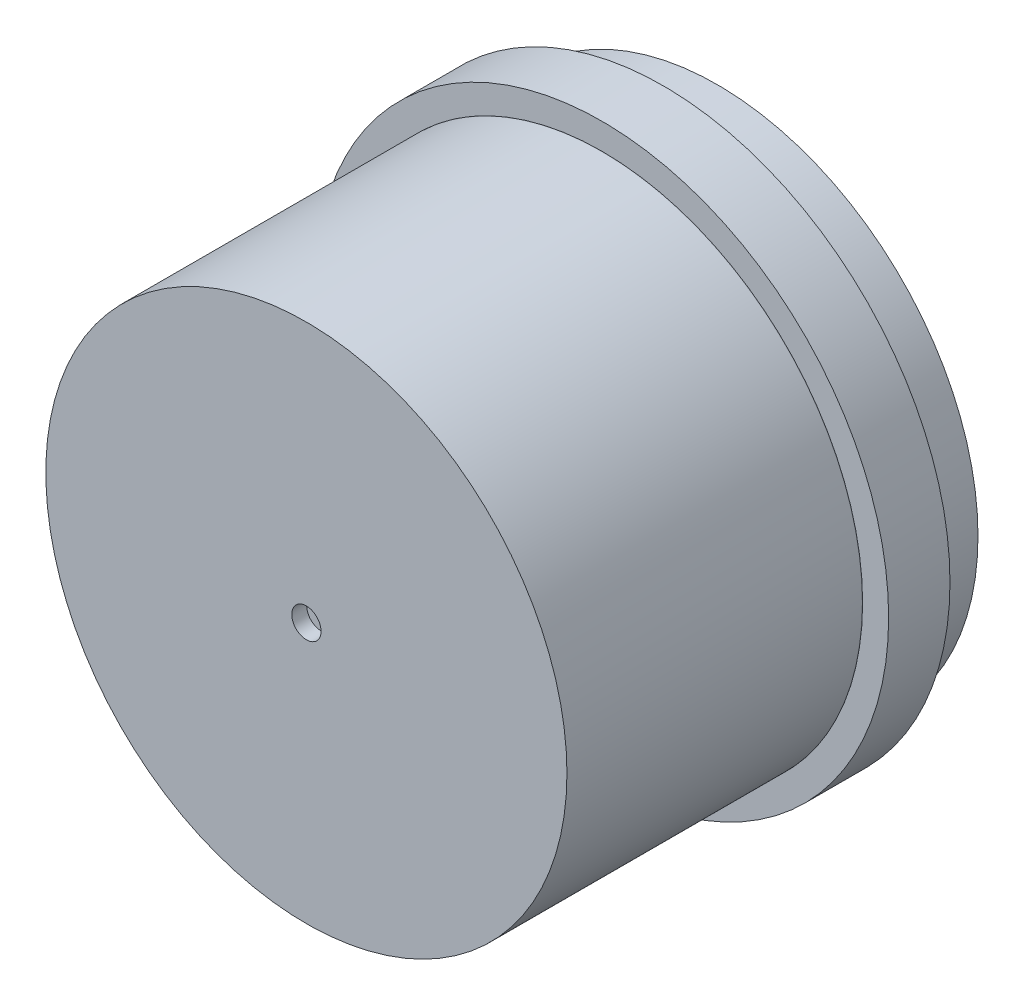
ISO-10303-21;
HEADER;
FILE_DESCRIPTION(('STEP AP214'),'2;1');
FILE_NAME('part.step','',(''),(''),'','','');
FILE_SCHEMA(('AUTOMOTIVE_DESIGN { 1 0 10303 214 1 1 1 1 }'));
ENDSEC;
DATA;
#1=APPLICATION_CONTEXT('core data for automotive mechanical design processes');
#2=APPLICATION_PROTOCOL_DEFINITION('international standard','automotive_design',2000,#1);
#3=PRODUCT_CONTEXT('',#1,'mechanical');
#4=PRODUCT('Part','Part','',(#3));
#5=PRODUCT_RELATED_PRODUCT_CATEGORY('part','',(#4));
#6=PRODUCT_DEFINITION_FORMATION('','',#4);
#7=PRODUCT_DEFINITION_CONTEXT('part definition',#1,'design');
#8=PRODUCT_DEFINITION('design','',#6,#7);
#9=PRODUCT_DEFINITION_SHAPE('','',#8);
#10=(LENGTH_UNIT() NAMED_UNIT(*) SI_UNIT(.MILLI.,.METRE.));
#11=(NAMED_UNIT(*) PLANE_ANGLE_UNIT() SI_UNIT($,.RADIAN.));
#12=(NAMED_UNIT(*) SI_UNIT($,.STERADIAN.) SOLID_ANGLE_UNIT());
#13=UNCERTAINTY_MEASURE_WITH_UNIT(LENGTH_MEASURE(1.E-05),#10,'distance_accuracy_value','');
#14=(GEOMETRIC_REPRESENTATION_CONTEXT(3) GLOBAL_UNCERTAINTY_ASSIGNED_CONTEXT((#13)) GLOBAL_UNIT_ASSIGNED_CONTEXT((#10,
#11,#12)) REPRESENTATION_CONTEXT('',''));
#15=CARTESIAN_POINT('',(0.,0.,0.));
#16=DIRECTION('',(0.,0.,1.));
#17=DIRECTION('',(1.,0.,0.));
#18=AXIS2_PLACEMENT_3D('',#15,#16,#17);
#19=CARTESIAN_POINT('',(0.,0.,-18.9845679100614));
#20=DIRECTION('',(0.,0.,-1.));
#21=DIRECTION('',(-1.,0.,0.));
#22=AXIS2_PLACEMENT_3D('',#19,#20,#21);
#23=PLANE('',#22);
#24=DIRECTION('',(-1.,0.,0.));
#25=VECTOR('',#24,1.);
#26=CARTESIAN_POINT('',(0.,39.9999999964937,-18.9845679100614));
#27=LINE('',#26,#25);
#28=CARTESIAN_POINT('',(0.000748999934972199,39.9999999964937,-18.9845679100614));
#29=VERTEX_POINT('',#28);
#30=CARTESIAN_POINT('',(-0.000748999934989471,40.,-18.9845679100614));
#31=VERTEX_POINT('',#30);
#32=EDGE_CURVE('P0_E19',#29,#31,#27,.T.);
#33=ORIENTED_EDGE('',*,*,#32,.T.);
#34=CARTESIAN_POINT('',(-0.000748999934989471,40.,-18.9845679100614));
#35=CARTESIAN_POINT('',(1.89567518805954E-09,40.0008099017736,-18.9845679100614));
#36=CARTESIAN_POINT('',(0.000748999934972199,39.9999999964937,-18.9845679100614));
#37=B_SPLINE_CURVE_WITH_KNOTS('',2,(#34,#35,#36),.UNSPECIFIED.,.F.,.F.,(3,3),(0.,1.),.UNSPECIFIED.);
#38=EDGE_CURVE('P0_E11',#31,#29,#37,.T.);
#39=ORIENTED_EDGE('',*,*,#38,.T.);
#40=EDGE_LOOP('',(#33,#39));
#41=FACE_BOUND('',#40,.T.);
#42=ADVANCED_FACE('P0_F17',(#41),#23,.T.);
#43=OPEN_SHELL('',(#42));
#44=SHELL_BASED_SURFACE_MODEL('P0_B1',(#43));
#45=CARTESIAN_POINT('',(0.,0.,-28.4));
#46=DIRECTION('',(0.,0.,-1.));
#47=DIRECTION('',(-1.,0.,0.));
#48=AXIS2_PLACEMENT_3D('',#45,#46,#47);
#49=PLANE('',#48);
#50=CARTESIAN_POINT('',(0.,0.,-28.4));
#51=DIRECTION('',(0.,0.,1.));
#52=DIRECTION('',(1.,0.,0.));
#53=AXIS2_PLACEMENT_3D('',#50,#51,#52);
#54=CIRCLE('',#53,2.25);
#55=CARTESIAN_POINT('',(2.25,0.,-28.4));
#56=VERTEX_POINT('',#55);
#57=EDGE_CURVE('P1_E20',#56,#56,#54,.F.);
#58=ORIENTED_EDGE('',*,*,#57,.T.);
#59=EDGE_LOOP('',(#58));
#60=FACE_BOUND('',#59,.T.);
#61=ADVANCED_FACE('P1_F17',(#60),#49,.T.);
#62=CARTESIAN_POINT('',(0.,0.,-34.1));
#63=DIRECTION('',(0.,0.,1.));
#64=DIRECTION('',(1.,0.,0.));
#65=AXIS2_PLACEMENT_3D('',#62,#63,#64);
#66=CYLINDRICAL_SURFACE('',#65,2.25);
#67=ORIENTED_EDGE('',*,*,#57,.F.);
#68=EDGE_LOOP('',(#67));
#69=FACE_BOUND('',#68,.T.);
#70=CARTESIAN_POINT('',(0.,0.,-33.6));
#71=DIRECTION('',(0.,0.,-1.));
#72=DIRECTION('',(-0.158255657589961,0.987398170365314,0.));
#73=AXIS2_PLACEMENT_3D('',#70,#71,#72);
#74=CIRCLE('',#73,2.25);
#75=CARTESIAN_POINT('',(-0.356075229577412,2.22164588332196,-33.6));
#76=VERTEX_POINT('',#75);
#77=EDGE_CURVE('P1_E146',#76,#76,#74,.F.);
#78=ORIENTED_EDGE('',*,*,#77,.F.);
#79=EDGE_LOOP('',(#78));
#80=FACE_BOUND('',#79,.T.);
#81=ADVANCED_FACE('P1_F151',(#69,#80),#66,.F.);
#82=CARTESIAN_POINT('',(0.,0.,-33.6));
#83=DIRECTION('',(0.,0.,-1.));
#84=DIRECTION('',(-0.158255657589961,0.987398170365314,0.));
#85=AXIS2_PLACEMENT_3D('',#82,#83,#84);
#86=TOROIDAL_SURFACE('',#85,2.75,0.5);
#87=ORIENTED_EDGE('',*,*,#77,.T.);
#88=EDGE_LOOP('',(#87));
#89=FACE_BOUND('',#88,.T.);
#90=CARTESIAN_POINT('',(0.,0.,-34.0330127018922));
#91=DIRECTION('',(0.,0.,1.));
#92=DIRECTION('',(1.,0.,0.));
#93=AXIS2_PLACEMENT_3D('',#90,#91,#92);
#94=CIRCLE('',#93,2.5);
#95=CARTESIAN_POINT('',(2.5,0.,-34.0330127018922));
#96=VERTEX_POINT('',#95);
#97=EDGE_CURVE('P1_E143',#96,#96,#94,.F.);
#98=ORIENTED_EDGE('',*,*,#97,.T.);
#99=EDGE_LOOP('',(#98));
#100=FACE_BOUND('',#99,.T.);
#101=ADVANCED_FACE('P1_F149',(#89,#100),#86,.T.);
#102=CARTESIAN_POINT('',(0.,0.,-149.837084989848));
#103=DIRECTION('',(0.,0.,1.));
#104=DIRECTION('',(1.,0.,0.));
#105=AXIS2_PLACEMENT_3D('',#102,#103,#104);
#106=CYLINDRICAL_SURFACE('',#105,2.5);
#107=ORIENTED_EDGE('',*,*,#97,.F.);
#108=EDGE_LOOP('',(#107));
#109=FACE_BOUND('',#108,.T.);
#110=CARTESIAN_POINT('',(0.,0.,-34.6));
#111=DIRECTION('',(0.,0.,1.));
#112=DIRECTION('',(1.,0.,0.));
#113=AXIS2_PLACEMENT_3D('',#110,#111,#112);
#114=CIRCLE('',#113,2.5);
#115=CARTESIAN_POINT('',(2.5,0.,-34.6));
#116=VERTEX_POINT('',#115);
#117=EDGE_CURVE('P1_E140',#116,#116,#114,.T.);
#118=ORIENTED_EDGE('',*,*,#117,.F.);
#119=EDGE_LOOP('',(#118));
#120=FACE_BOUND('',#119,.T.);
#121=ADVANCED_FACE('P1_F134',(#109,#120),#106,.F.);
#122=CARTESIAN_POINT('',(0.,0.,-35.1));
#123=DIRECTION('',(0.,0.,1.));
#124=DIRECTION('',(1.,0.,0.));
#125=AXIS2_PLACEMENT_3D('',#122,#123,#124);
#126=TOROIDAL_SURFACE('',#125,2.5,0.5);
#127=ORIENTED_EDGE('',*,*,#117,.T.);
#128=EDGE_LOOP('',(#127));
#129=FACE_BOUND('',#128,.T.);
#130=CARTESIAN_POINT('',(0.,0.,-35.1));
#131=DIRECTION('',(0.,0.,1.));
#132=DIRECTION('',(1.,0.,0.));
#133=AXIS2_PLACEMENT_3D('',#130,#131,#132);
#134=CIRCLE('',#133,2.);
#135=CARTESIAN_POINT('',(2.,0.,-35.1));
#136=VERTEX_POINT('',#135);
#137=EDGE_CURVE('P1_E139',#136,#136,#134,.F.);
#138=ORIENTED_EDGE('',*,*,#137,.T.);
#139=EDGE_LOOP('',(#138));
#140=FACE_BOUND('',#139,.T.);
#141=ADVANCED_FACE('P1_F129',(#129,#140),#126,.T.);
#142=CARTESIAN_POINT('',(0.,0.,-36.7));
#143=DIRECTION('',(0.,0.,1.));
#144=DIRECTION('',(1.,0.,0.));
#145=AXIS2_PLACEMENT_3D('',#142,#143,#144);
#146=CYLINDRICAL_SURFACE('',#145,2.);
#147=ORIENTED_EDGE('',*,*,#137,.F.);
#148=EDGE_LOOP('',(#147));
#149=FACE_BOUND('',#148,.T.);
#150=CARTESIAN_POINT('',(0.,0.,-35.2));
#151=DIRECTION('',(0.,0.,-1.));
#152=DIRECTION('',(-1.,0.,0.));
#153=AXIS2_PLACEMENT_3D('',#150,#151,#152);
#154=CIRCLE('',#153,2.);
#155=CARTESIAN_POINT('',(-2.,0.,-35.2));
#156=VERTEX_POINT('',#155);
#157=EDGE_CURVE('P1_E114',#156,#156,#154,.F.);
#158=ORIENTED_EDGE('',*,*,#157,.F.);
#159=EDGE_LOOP('',(#158));
#160=FACE_BOUND('',#159,.T.);
#161=ADVANCED_FACE('P1_F124',(#149,#160),#146,.F.);
#162=CARTESIAN_POINT('',(0.,0.,-35.2));
#163=DIRECTION('',(0.,0.,-1.));
#164=DIRECTION('',(-1.,0.,0.));
#165=AXIS2_PLACEMENT_3D('',#162,#163,#164);
#166=TOROIDAL_SURFACE('',#165,3.5,1.5);
#167=CARTESIAN_POINT('',(0.,0.,-36.3180339887499));
#168=DIRECTION('',(0.,0.,1.));
#169=DIRECTION('',(1.,0.,0.));
#170=AXIS2_PLACEMENT_3D('',#167,#168,#169);
#171=CIRCLE('',#170,2.5);
#172=CARTESIAN_POINT('',(2.5,0.,-36.3180339887499));
#173=VERTEX_POINT('',#172);
#174=EDGE_CURVE('P1_E110',#173,#173,#171,.F.);
#175=ORIENTED_EDGE('',*,*,#174,.T.);
#176=EDGE_LOOP('',(#175));
#177=FACE_BOUND('',#176,.T.);
#178=ORIENTED_EDGE('',*,*,#157,.T.);
#179=EDGE_LOOP('',(#178));
#180=FACE_BOUND('',#179,.T.);
#181=ADVANCED_FACE('P1_F119',(#177,#180),#166,.T.);
#182=CARTESIAN_POINT('',(0.,0.,-149.837084989848));
#183=DIRECTION('',(0.,0.,1.));
#184=DIRECTION('',(1.,0.,0.));
#185=AXIS2_PLACEMENT_3D('',#182,#183,#184);
#186=CYLINDRICAL_SURFACE('',#185,2.5);
#187=ORIENTED_EDGE('',*,*,#174,.F.);
#188=EDGE_LOOP('',(#187));
#189=FACE_BOUND('',#188,.T.);
#190=CARTESIAN_POINT('',(0.,0.,-36.7));
#191=DIRECTION('',(0.,0.,1.));
#192=DIRECTION('',(1.,0.,0.));
#193=AXIS2_PLACEMENT_3D('',#190,#191,#192);
#194=CIRCLE('',#193,2.5);
#195=CARTESIAN_POINT('',(2.5,0.,-36.7));
#196=VERTEX_POINT('',#195);
#197=EDGE_CURVE('P1_E113',#196,#196,#194,.T.);
#198=ORIENTED_EDGE('',*,*,#197,.F.);
#199=EDGE_LOOP('',(#198));
#200=FACE_BOUND('',#199,.T.);
#201=ADVANCED_FACE('P1_F123',(#189,#200),#186,.F.);
#202=CARTESIAN_POINT('',(0.,0.,-36.7));
#203=DIRECTION('',(0.,0.,-1.));
#204=DIRECTION('',(-1.,0.,0.));
#205=AXIS2_PLACEMENT_3D('',#202,#203,#204);
#206=PLANE('',#205);
#207=ORIENTED_EDGE('',*,*,#197,.T.);
#208=EDGE_LOOP('',(#207));
#209=FACE_BOUND('',#208,.T.);
#210=CARTESIAN_POINT('',(0.,0.,-36.7));
#211=DIRECTION('',(0.,0.,1.));
#212=DIRECTION('',(1.,0.,0.));
#213=AXIS2_PLACEMENT_3D('',#210,#211,#212);
#214=CIRCLE('',#213,40.);
#215=CARTESIAN_POINT('',(40.,0.,-36.7));
#216=VERTEX_POINT('',#215);
#217=EDGE_CURVE('P1_E216',#216,#216,#214,.T.);
#218=ORIENTED_EDGE('',*,*,#217,.F.);
#219=EDGE_LOOP('',(#218));
#220=FACE_BOUND('',#219,.T.);
#221=ADVANCED_FACE('P1_F221',(#209,#220),#206,.T.);
#222=CARTESIAN_POINT('',(0.,0.,-149.837084989848));
#223=DIRECTION('',(0.,0.,1.));
#224=DIRECTION('',(1.,0.,0.));
#225=AXIS2_PLACEMENT_3D('',#222,#223,#224);
#226=CYLINDRICAL_SURFACE('',#225,40.);
#227=ORIENTED_EDGE('',*,*,#217,.T.);
#228=EDGE_LOOP('',(#227));
#229=FACE_BOUND('',#228,.T.);
#230=CARTESIAN_POINT('',(0.,0.,-28.4));
#231=DIRECTION('',(0.,0.,1.));
#232=DIRECTION('',(1.,0.,0.));
#233=AXIS2_PLACEMENT_3D('',#230,#231,#232);
#234=CIRCLE('',#233,40.);
#235=CARTESIAN_POINT('',(40.,0.,-28.4));
#236=VERTEX_POINT('',#235);
#237=EDGE_CURVE('P1_E213',#236,#236,#234,.T.);
#238=ORIENTED_EDGE('',*,*,#237,.F.);
#239=EDGE_LOOP('',(#238));
#240=FACE_BOUND('',#239,.T.);
#241=ADVANCED_FACE('P1_F229',(#229,#240),#226,.T.);
#242=CARTESIAN_POINT('',(0.,0.,-28.4));
#243=DIRECTION('',(0.,0.,-1.));
#244=DIRECTION('',(-1.,0.,0.));
#245=AXIS2_PLACEMENT_3D('',#242,#243,#244);
#246=PLANE('',#245);
#247=ORIENTED_EDGE('',*,*,#237,.T.);
#248=EDGE_LOOP('',(#247));
#249=FACE_BOUND('',#248,.T.);
#250=CARTESIAN_POINT('',(0.,0.,-28.4));
#251=DIRECTION('',(0.,0.,1.));
#252=DIRECTION('',(1.,0.,0.));
#253=AXIS2_PLACEMENT_3D('',#250,#251,#252);
#254=CIRCLE('',#253,44.);
#255=CARTESIAN_POINT('',(44.,0.,-28.4));
#256=VERTEX_POINT('',#255);
#257=EDGE_CURVE('P1_E210',#256,#256,#254,.T.);
#258=ORIENTED_EDGE('',*,*,#257,.F.);
#259=EDGE_LOOP('',(#258));
#260=FACE_BOUND('',#259,.T.);
#261=ADVANCED_FACE('P1_F241',(#249,#260),#246,.T.);
#262=CARTESIAN_POINT('',(0.,0.,6.9));
#263=DIRECTION('',(0.,0.,1.));
#264=DIRECTION('',(1.,0.,0.));
#265=AXIS2_PLACEMENT_3D('',#262,#263,#264);
#266=CYLINDRICAL_SURFACE('',#265,44.);
#267=ORIENTED_EDGE('',*,*,#257,.T.);
#268=EDGE_LOOP('',(#267));
#269=FACE_BOUND('',#268,.T.);
#270=CARTESIAN_POINT('',(0.,0.,-18.9845679100614));
#271=DIRECTION('',(0.,0.,1.));
#272=DIRECTION('',(1.,0.,0.));
#273=AXIS2_PLACEMENT_3D('',#270,#271,#272);
#274=CIRCLE('',#273,44.);
#275=CARTESIAN_POINT('',(44.,0.,-18.9845679100614));
#276=VERTEX_POINT('',#275);
#277=EDGE_CURVE('P1_E109',#276,#276,#274,.F.);
#278=ORIENTED_EDGE('',*,*,#277,.T.);
#279=EDGE_LOOP('',(#278));
#280=FACE_BOUND('',#279,.T.);
#281=ADVANCED_FACE('P1_F247',(#269,#280),#266,.T.);
#282=CARTESIAN_POINT('',(0.,0.,24.1));
#283=DIRECTION('',(0.,0.,-1.));
#284=DIRECTION('',(-1.,0.,0.));
#285=AXIS2_PLACEMENT_3D('',#282,#283,#284);
#286=PLANE('',#285);
#287=CARTESIAN_POINT('',(0.,0.,24.1));
#288=DIRECTION('',(0.,0.,1.));
#289=DIRECTION('',(1.,0.,0.));
#290=AXIS2_PLACEMENT_3D('',#287,#288,#289);
#291=CIRCLE('',#290,2.25);
#292=CARTESIAN_POINT('',(2.25,0.,24.1));
#293=VERTEX_POINT('',#292);
#294=EDGE_CURVE('P1_E59',#293,#293,#291,.T.);
#295=ORIENTED_EDGE('',*,*,#294,.T.);
#296=EDGE_LOOP('',(#295));
#297=FACE_BOUND('',#296,.T.);
#298=ADVANCED_FACE('P1_F251',(#297),#286,.F.);
#299=CARTESIAN_POINT('',(40.,34.2254423942324,-14.1));
#300=DIRECTION('',(-1.,0.,0.));
#301=DIRECTION('',(0.,-1.,0.));
#302=AXIS2_PLACEMENT_3D('',#299,#300,#301);
#303=PLANE('',#302);
#304=CARTESIAN_POINT('',(39.9999999229682,0.257200349144793,-18.9845679598042));
#305=CARTESIAN_POINT('',(39.9999999400256,0.246483398540135,-18.9828748797583));
#306=CARTESIAN_POINT('',(39.9999999534318,0.235766476274754,-18.9811816203384));
#307=CARTESIAN_POINT('',(39.9999999746219,0.214332728619243,-18.9777947950462));
#308=CARTESIAN_POINT('',(39.9999999824059,0.203615903228896,-18.9761012291752));
#309=CARTESIAN_POINT('',(39.9999999940319,0.182182335497312,-18.9727138347434));
#310=CARTESIAN_POINT('',(39.9999999978739,0.171465593155915,-18.9710200061835));
#311=CARTESIAN_POINT('',(40.0000000029786,0.15003217768898,-18.9676321301457));
#312=CARTESIAN_POINT('',(40.0000000042413,0.139315504563332,-18.9659380826685));
#313=CARTESIAN_POINT('',(40.0000000053189,0.117882213690388,-18.9625498125728));
#314=CARTESIAN_POINT('',(40.0000000051339,0.107165595943022,-18.9608555899548));
#315=CARTESIAN_POINT('',(40.0000000041877,0.0857324019852834,-18.9574670133591));
#316=CARTESIAN_POINT('',(40.0000000034265,0.0750158257748705,-18.9557726593816));
#317=CARTESIAN_POINT('',(40.0000000019685,0.0535827010469698,-18.9523838638515));
#318=CARTESIAN_POINT('',(40.0000000012716,0.0428661525294641,-18.9506894222991));
#319=CARTESIAN_POINT('',(40.0000000002649,0.0214330693412253,-18.9473004954064));
#320=CARTESIAN_POINT('',(39.9999999999551,0.0107165346704877,-18.9456060100661));
#321=CARTESIAN_POINT('',(40.,0.,-18.9439115247254));
#322=B_SPLINE_CURVE_WITH_KNOTS('',3,(#304,#305,#306,#307,#308,#309,#310,#311,#312,#313,#314,
#315,#316,#317,#318,#319,#320,#321),.UNSPECIFIED.,.F.,.F.,(4,2,2,2,2,2,2,2,4),(0.,
0.0325495922018185,0.0650990408295737,0.097648366386968,0.130197589380877,0.162746730320823,
0.195295809718446,0.22784484808697,0.260393865940681),.UNSPECIFIED.);
#323=CARTESIAN_POINT('',(40.0000001912472,0.257200350869829,-18.9845679100614));
#324=VERTEX_POINT('',#323);
#325=CARTESIAN_POINT('',(40.,0.,-18.9439115247254));
#326=VERTEX_POINT('',#325);
#327=EDGE_CURVE('P1_E67',#324,#326,#322,.T.);
#328=ORIENTED_EDGE('',*,*,#327,.T.);
#329=CARTESIAN_POINT('',(40.,0.,-18.9439115247254));
#330=CARTESIAN_POINT('',(39.9999999999551,-0.0107165384940411,-18.945606010065));
#331=CARTESIAN_POINT('',(40.0000000002618,-0.0214330769883218,-18.9473004954041));
#332=CARTESIAN_POINT('',(40.0000000012562,-0.042866167823635,-18.9506894222945));
#333=CARTESIAN_POINT('',(40.0000000019439,-0.0535827201646719,-18.9523838638458));
#334=CARTESIAN_POINT('',(40.0000000033773,-0.075015852539635,-18.9557726593736));
#335=CARTESIAN_POINT('',(40.000000004123,-0.085732432573579,-18.95746701335));
#336=CARTESIAN_POINT('',(40.0000000050323,-0.107165634178392,-18.9608555899434));
#337=CARTESIAN_POINT('',(40.0000000051958,-0.117882255749302,-18.9625498125603));
#338=CARTESIAN_POINT('',(40.0000000040689,-0.139315554269331,-18.9659380826537));
#339=CARTESIAN_POINT('',(40.0000000027784,-0.150032231218523,-18.9676321301298));
#340=CARTESIAN_POINT('',(39.9999999976122,-0.171465654332531,-18.9710200061653));
#341=CARTESIAN_POINT('',(39.9999999937363,-0.182182400497459,-18.9727138347241));
#342=CARTESIAN_POINT('',(39.9999999820364,-0.203615975876116,-18.9761012291537));
#343=CARTESIAN_POINT('',(39.9999999742124,-0.214332805090007,-18.9777947950235));
#344=CARTESIAN_POINT('',(39.9999999529361,-0.23576656039259,-18.9811816203135));
#345=CARTESIAN_POINT('',(39.9999999394837,-0.246483486481502,-18.9828748797322));
#346=CARTESIAN_POINT('',(39.999999922377,-0.25720044090968,-18.984567959777));
#347=B_SPLINE_CURVE_WITH_KNOTS('',3,(#329,#330,#331,#332,#333,#334,#335,#336,#337,#338,#339,
#340,#341,#342,#343,#344,#345,#346),.UNSPECIFIED.,.F.,.F.,(4,2,2,2,2,2,2,2,4),(0.,
0.0325490291830509,0.065098078880888,0.0976471696078377,0.130196321877169,0.162745556200493,
0.195294893087303,0.227844353044556,0.260393956575888),.UNSPECIFIED.);
#348=CARTESIAN_POINT('',(40.0000001916911,-0.25720044264137,-18.9845679349192));
#349=VERTEX_POINT('',#348);
#350=EDGE_CURVE('P1_E48',#326,#349,#347,.T.);
#351=ORIENTED_EDGE('',*,*,#350,.T.);
#352=DIRECTION('',(0.,1.,0.));
#353=VECTOR('',#352,1.);
#354=CARTESIAN_POINT('',(40.0000004610052,0.,-18.9845679100614));
#355=LINE('',#354,#353);
#356=EDGE_CURVE('P1_E60',#349,#324,#355,.T.);
#357=ORIENTED_EDGE('',*,*,#356,.T.);
#358=EDGE_LOOP('',(#328,#351,#357));
#359=FACE_BOUND('',#358,.T.);
#360=ADVANCED_FACE('P1_F203',(#359),#303,.F.);
#361=CARTESIAN_POINT('',(-40.,40.6366416317518,-14.1));
#362=DIRECTION('',(1.,0.,0.));
#363=DIRECTION('',(0.,1.,0.));
#364=AXIS2_PLACEMENT_3D('',#361,#362,#363);
#365=PLANE('',#364);
#366=CARTESIAN_POINT('',(-39.999999922968,-0.25720034916729,-18.9845679598043));
#367=CARTESIAN_POINT('',(-39.9999999400255,-0.246483398561697,-18.9828748797583));
#368=CARTESIAN_POINT('',(-39.9999999534317,-0.23576647629538,-18.9811816203384));
#369=CARTESIAN_POINT('',(-39.9999999746218,-0.214332728637993,-18.9777947950462));
#370=CARTESIAN_POINT('',(-39.9999999824058,-0.203615903246704,-18.9761012291752));
#371=CARTESIAN_POINT('',(-39.9999999940318,-0.182182335513244,-18.9727138347434));
#372=CARTESIAN_POINT('',(-39.9999999978738,-0.171465593170911,-18.9710200061835));
#373=CARTESIAN_POINT('',(-40.0000000029785,-0.150032177702106,-18.9676321301457));
#374=CARTESIAN_POINT('',(-40.0000000042412,-0.139315504575522,-18.9659380826685));
#375=CARTESIAN_POINT('',(-40.0000000053189,-0.117882213700702,-18.9625498125728));
#376=CARTESIAN_POINT('',(-40.0000000051339,-0.107165595952395,-18.9608555899548));
#377=CARTESIAN_POINT('',(-40.0000000041877,-0.0857324019927791,-18.9574670133591));
#378=CARTESIAN_POINT('',(-40.0000000034265,-0.075015825781431,-18.9557726593816));
#379=CARTESIAN_POINT('',(-40.0000000019685,-0.0535827010516537,-18.9523838638515));
#380=CARTESIAN_POINT('',(-40.0000000012716,-0.0428661525332066,-18.9506894222991));
#381=CARTESIAN_POINT('',(-40.0000000002649,-0.021433069343091,-18.9473004954064));
#382=CARTESIAN_POINT('',(-39.999999999955,-0.0107165346714179,-18.9456060100661));
#383=CARTESIAN_POINT('',(-40.,0.,-18.9439115247254));
#384=B_SPLINE_CURVE_WITH_KNOTS('',3,(#366,#367,#368,#369,#370,#371,#372,#373,#374,#375,#376,
#377,#378,#379,#380,#381,#382,#383),.UNSPECIFIED.,.F.,.F.,(4,2,2,2,2,2,2,2,4),(0.,
0.0325495922045908,0.0650990408351353,0.0976483663953007,0.130197589391982,0.162746730334718,
0.195295809735111,0.227844848106425,0.260393865962908),.UNSPECIFIED.);
#385=CARTESIAN_POINT('',(-40.0000001912471,-0.257200350892331,-18.9845679100614));
#386=VERTEX_POINT('',#385);
#387=CARTESIAN_POINT('',(-40.,0.,-18.9439115247254));
#388=VERTEX_POINT('',#387);
#389=EDGE_CURVE('P1_E35',#386,#388,#384,.T.);
#390=ORIENTED_EDGE('',*,*,#389,.T.);
#391=CARTESIAN_POINT('',(-40.,0.,-18.9439115247254));
#392=CARTESIAN_POINT('',(-39.9999999999551,0.0107165384950364,-18.945606010065));
#393=CARTESIAN_POINT('',(-40.0000000002618,0.0214330769903179,-18.9473004954041));
#394=CARTESIAN_POINT('',(-40.0000000012562,0.0428661678276505,-18.9506894222945));
#395=CARTESIAN_POINT('',(-40.0000000019438,0.053582720169706,-18.9523838638458));
#396=CARTESIAN_POINT('',(-40.0000000033772,0.0750158525467002,-18.9557726593736));
#397=CARTESIAN_POINT('',(-40.000000004123,0.0857324325816567,-18.95746701335));
#398=CARTESIAN_POINT('',(-40.0000000050323,0.107165634188489,-18.9608555899434));
#399=CARTESIAN_POINT('',(-40.0000000051958,0.117882255760405,-18.9625498125603));
#400=CARTESIAN_POINT('',(-40.0000000040688,0.139315554282442,-18.9659380826537));
#401=CARTESIAN_POINT('',(-40.0000000027784,0.150032231232634,-18.9676321301298));
#402=CARTESIAN_POINT('',(-39.9999999976121,0.171465654348655,-18.9710200061653));
#403=CARTESIAN_POINT('',(-39.9999999937362,0.182182400514596,-18.9727138347241));
#404=CARTESIAN_POINT('',(-39.9999999820363,0.203615975895272,-18.9761012291537));
#405=CARTESIAN_POINT('',(-39.9999999742123,0.214332805110169,-18.9777947950235));
#406=CARTESIAN_POINT('',(-39.999999952936,0.235766560414772,-18.9811816203135));
#407=CARTESIAN_POINT('',(-39.9999999394836,0.246483486504696,-18.9828748797322));
#408=CARTESIAN_POINT('',(-39.9999999223769,0.257200440933887,-18.984567959777));
#409=B_SPLINE_CURVE_WITH_KNOTS('',3,(#391,#392,#393,#394,#395,#396,#397,#398,#399,#400,#401,
#402,#403,#404,#405,#406,#407,#408),.UNSPECIFIED.,.F.,.F.,(4,2,2,2,2,2,2,2,4),(0.,
0.0325490291860161,0.0650980788868711,0.097647169616821,0.130196321889135,0.162745556215424,
0.195294893105236,0.227844353065471,0.260393956599804),.UNSPECIFIED.);
#410=CARTESIAN_POINT('',(-40.000000191691,0.257200442665581,-18.9845679349192));
#411=VERTEX_POINT('',#410);
#412=EDGE_CURVE('P1_E55',#388,#411,#409,.T.);
#413=ORIENTED_EDGE('',*,*,#412,.T.);
#414=DIRECTION('',(0.,1.,0.));
#415=VECTOR('',#414,1.);
#416=CARTESIAN_POINT('',(-40.000000461005,0.,-18.9845679100614));
#417=LINE('',#416,#415);
#418=EDGE_CURVE('P1_E51',#411,#386,#417,.F.);
#419=ORIENTED_EDGE('',*,*,#418,.T.);
#420=EDGE_LOOP('',(#390,#413,#419));
#421=FACE_BOUND('',#420,.T.);
#422=ADVANCED_FACE('P1_F53',(#421),#365,.F.);
#423=CARTESIAN_POINT('',(0.,0.,-18.9845679100614));
#424=DIRECTION('',(0.,0.,-1.));
#425=DIRECTION('',(-1.,0.,0.));
#426=AXIS2_PLACEMENT_3D('',#423,#424,#425);
#427=PLANE('',#426);
#428=CARTESIAN_POINT('',(0.,0.,-18.9845679100614));
#429=DIRECTION('',(0.,0.,1.));
#430=DIRECTION('',(1.,0.,0.));
#431=AXIS2_PLACEMENT_3D('',#428,#429,#430);
#432=CIRCLE('',#431,40.0008268126439);
#433=EDGE_CURVE('P1_E187',#411,#324,#432,.F.);
#434=ORIENTED_EDGE('',*,*,#433,.T.);
#435=ORIENTED_EDGE('',*,*,#356,.F.);
#436=CARTESIAN_POINT('',(0.,0.,-18.9845679100614));
#437=DIRECTION('',(0.,0.,1.));
#438=DIRECTION('',(1.,0.,0.));
#439=AXIS2_PLACEMENT_3D('',#436,#437,#438);
#440=CIRCLE('',#439,40.0008268126439);
#441=EDGE_CURVE('P1_E63',#349,#386,#440,.F.);
#442=ORIENTED_EDGE('',*,*,#441,.T.);
#443=ORIENTED_EDGE('',*,*,#418,.F.);
#444=EDGE_LOOP('',(#434,#435,#442,#443));
#445=FACE_BOUND('',#444,.T.);
#446=ORIENTED_EDGE('',*,*,#277,.F.);
#447=EDGE_LOOP('',(#446));
#448=FACE_BOUND('',#447,.T.);
#449=ADVANCED_FACE('P1_F64',(#445,#448),#427,.F.);
#450=CARTESIAN_POINT('',(0.,0.,-34.1));
#451=DIRECTION('',(0.,0.,1.));
#452=DIRECTION('',(1.,0.,0.));
#453=AXIS2_PLACEMENT_3D('',#450,#451,#452);
#454=CYLINDRICAL_SURFACE('',#453,2.25);
#455=ORIENTED_EDGE('',*,*,#294,.F.);
#456=EDGE_LOOP('',(#455));
#457=FACE_BOUND('',#456,.T.);
#458=CARTESIAN_POINT('',(0.,0.,26.4));
#459=DIRECTION('',(0.,0.,1.));
#460=DIRECTION('',(1.,0.,0.));
#461=AXIS2_PLACEMENT_3D('',#458,#459,#460);
#462=CIRCLE('',#461,2.25);
#463=CARTESIAN_POINT('',(2.25,0.,26.4));
#464=VERTEX_POINT('',#463);
#465=EDGE_CURVE('P1_E178',#464,#464,#462,.F.);
#466=ORIENTED_EDGE('',*,*,#465,.F.);
#467=EDGE_LOOP('',(#466));
#468=FACE_BOUND('',#467,.T.);
#469=ADVANCED_FACE('P1_F94',(#457,#468),#454,.F.);
#470=CARTESIAN_POINT('',(0.,0.,-18.9439115247254));
#471=DIRECTION('',(0.,0.,1.));
#472=DIRECTION('',(1.,0.,0.));
#473=AXIS2_PLACEMENT_3D('',#470,#471,#472);
#474=TOROIDAL_SURFACE('',#473,41.,1.);
#475=ORIENTED_EDGE('',*,*,#350,.F.);
#476=CARTESIAN_POINT('',(0.,0.,-18.9439115247254));
#477=DIRECTION('',(0.,0.,1.));
#478=DIRECTION('',(1.,0.,0.));
#479=AXIS2_PLACEMENT_3D('',#476,#477,#478);
#480=CIRCLE('',#479,40.);
#481=EDGE_CURVE('P1_E71',#388,#326,#480,.T.);
#482=ORIENTED_EDGE('',*,*,#481,.F.);
#483=ORIENTED_EDGE('',*,*,#389,.F.);
#484=ORIENTED_EDGE('',*,*,#441,.F.);
#485=EDGE_LOOP('',(#475,#482,#483,#484));
#486=FACE_BOUND('',#485,.T.);
#487=ADVANCED_FACE('P1_F69',(#486),#474,.F.);
#488=CARTESIAN_POINT('',(0.,0.,-18.9439115247254));
#489=DIRECTION('',(0.,0.,1.));
#490=DIRECTION('',(1.,0.,0.));
#491=AXIS2_PLACEMENT_3D('',#488,#489,#490);
#492=TOROIDAL_SURFACE('',#491,41.,1.);
#493=ORIENTED_EDGE('',*,*,#412,.F.);
#494=CARTESIAN_POINT('',(0.,0.,-18.9439115247254));
#495=DIRECTION('',(0.,0.,1.));
#496=DIRECTION('',(1.,0.,0.));
#497=AXIS2_PLACEMENT_3D('',#494,#495,#496);
#498=CIRCLE('',#497,40.);
#499=EDGE_CURVE('P1_E26',#326,#388,#498,.T.);
#500=ORIENTED_EDGE('',*,*,#499,.F.);
#501=ORIENTED_EDGE('',*,*,#327,.F.);
#502=ORIENTED_EDGE('',*,*,#433,.F.);
#503=EDGE_LOOP('',(#493,#500,#501,#502));
#504=FACE_BOUND('',#503,.T.);
#505=ADVANCED_FACE('P1_F93',(#504),#492,.F.);
#506=CARTESIAN_POINT('',(0.,0.,26.4));
#507=DIRECTION('',(0.,0.,1.));
#508=DIRECTION('',(1.,0.,0.));
#509=AXIS2_PLACEMENT_3D('',#506,#507,#508);
#510=PLANE('',#509);
#511=ORIENTED_EDGE('',*,*,#465,.T.);
#512=EDGE_LOOP('',(#511));
#513=FACE_BOUND('',#512,.T.);
#514=CARTESIAN_POINT('',(0.,0.,26.4));
#515=DIRECTION('',(0.,0.,1.));
#516=DIRECTION('',(1.,0.,0.));
#517=AXIS2_PLACEMENT_3D('',#514,#515,#516);
#518=CIRCLE('',#517,40.);
#519=CARTESIAN_POINT('',(40.,0.,26.4));
#520=VERTEX_POINT('',#519);
#521=EDGE_CURVE('P1_E11',#520,#520,#518,.F.);
#522=ORIENTED_EDGE('',*,*,#521,.F.);
#523=EDGE_LOOP('',(#522));
#524=FACE_BOUND('',#523,.T.);
#525=ADVANCED_FACE('P1_F164',(#513,#524),#510,.T.);
#526=CARTESIAN_POINT('',(0.,0.,-149.837084989848));
#527=DIRECTION('',(0.,0.,1.));
#528=DIRECTION('',(1.,0.,0.));
#529=AXIS2_PLACEMENT_3D('',#526,#527,#528);
#530=CYLINDRICAL_SURFACE('',#529,40.);
#531=ORIENTED_EDGE('',*,*,#521,.T.);
#532=EDGE_LOOP('',(#531));
#533=FACE_BOUND('',#532,.T.);
#534=ORIENTED_EDGE('',*,*,#499,.T.);
#535=ORIENTED_EDGE('',*,*,#481,.T.);
#536=EDGE_LOOP('',(#534,#535));
#537=FACE_BOUND('',#536,.T.);
#538=ADVANCED_FACE('P1_F162',(#533,#537),#530,.T.);
#539=CLOSED_SHELL('',(#61,#81,#101,#121,#141,#161,#181,#201,#221,#241,#261,#281,#298,#360,#422,
#449,#469,#487,#505,#525,#538));
#540=MANIFOLD_SOLID_BREP('P1_B1',#539);
#541=ADVANCED_BREP_SHAPE_REPRESENTATION('',(#18,#540),#14);
#542=MANIFOLD_SURFACE_SHAPE_REPRESENTATION('',(#18,#44),#14);
#543=SHAPE_REPRESENTATION('',(#18),#14);
#544=SHAPE_DEFINITION_REPRESENTATION(#9,#543);
#545=SHAPE_REPRESENTATION_RELATIONSHIP('','',#543,#541);
#546=SHAPE_REPRESENTATION_RELATIONSHIP('','',#543,#542);
ENDSEC;
END-ISO-10303-21;
